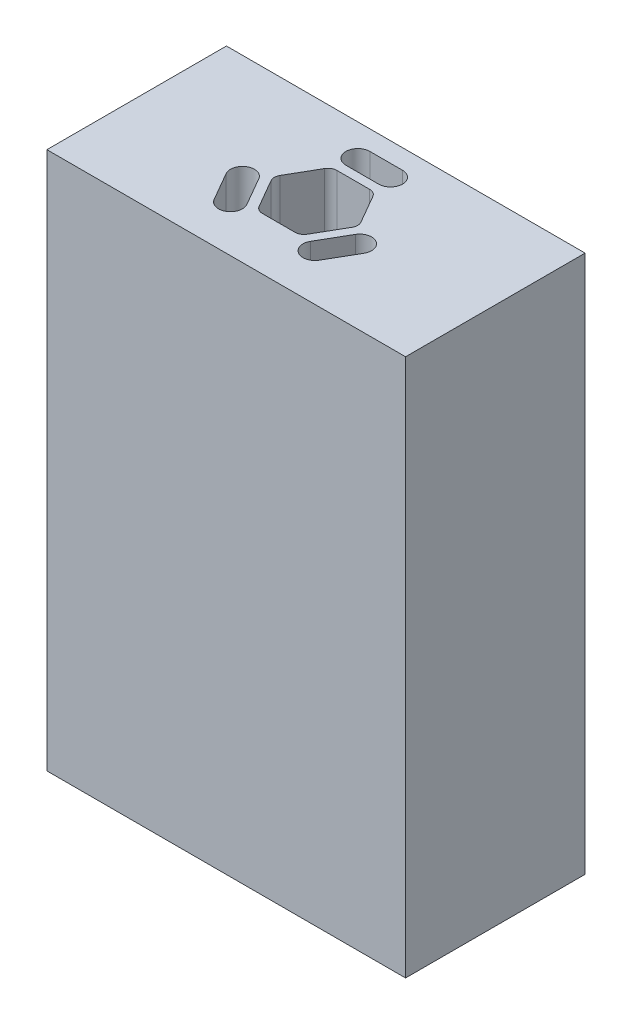
ISO-10303-21;
HEADER;
FILE_DESCRIPTION(('STEP AP214'),'2;1');
FILE_NAME('part.step','',(''),(''),'','','');
FILE_SCHEMA(('AUTOMOTIVE_DESIGN { 1 0 10303 214 1 1 1 1 }'));
ENDSEC;
DATA;
#1=APPLICATION_CONTEXT('core data for automotive mechanical design processes');
#2=APPLICATION_PROTOCOL_DEFINITION('international standard','automotive_design',2000,#1);
#3=PRODUCT_CONTEXT('',#1,'mechanical');
#4=PRODUCT('Part','Part','',(#3));
#5=PRODUCT_RELATED_PRODUCT_CATEGORY('part','',(#4));
#6=PRODUCT_DEFINITION_FORMATION('','',#4);
#7=PRODUCT_DEFINITION_CONTEXT('part definition',#1,'design');
#8=PRODUCT_DEFINITION('design','',#6,#7);
#9=PRODUCT_DEFINITION_SHAPE('','',#8);
#10=(LENGTH_UNIT() NAMED_UNIT(*) SI_UNIT(.MILLI.,.METRE.));
#11=(NAMED_UNIT(*) PLANE_ANGLE_UNIT() SI_UNIT($,.RADIAN.));
#12=(NAMED_UNIT(*) SI_UNIT($,.STERADIAN.) SOLID_ANGLE_UNIT());
#13=UNCERTAINTY_MEASURE_WITH_UNIT(LENGTH_MEASURE(1.E-05),#10,'distance_accuracy_value','');
#14=(GEOMETRIC_REPRESENTATION_CONTEXT(3) GLOBAL_UNCERTAINTY_ASSIGNED_CONTEXT((#13)) GLOBAL_UNIT_ASSIGNED_CONTEXT((#10,
#11,#12)) REPRESENTATION_CONTEXT('',''));
#15=CARTESIAN_POINT('',(0.,0.,0.));
#16=DIRECTION('',(0.,0.,1.));
#17=DIRECTION('',(1.,0.,0.));
#18=AXIS2_PLACEMENT_3D('',#15,#16,#17);
#19=CARTESIAN_POINT('',(-0.0911324865405191,-0.9,-0.157846096908266));
#20=DIRECTION('',(0.,-1.,0.));
#21=DIRECTION('',(0.,0.,-1.));
#22=AXIS2_PLACEMENT_3D('',#19,#20,#21);
#23=PLANE('',#22);
#24=DIRECTION('',(-1.,0.,0.));
#25=VECTOR('',#24,1.);
#26=CARTESIAN_POINT('',(0.0911324865405191,-0.9,-0.207846096908266));
#27=LINE('',#26,#25);
#28=CARTESIAN_POINT('',(0.0911324865405191,-0.9,-0.207846096908266));
#29=VERTEX_POINT('',#28);
#30=CARTESIAN_POINT('',(0.,-0.9,-0.207846096908266));
#31=VERTEX_POINT('',#30);
#32=EDGE_CURVE('E295',#29,#31,#27,.T.);
#33=ORIENTED_EDGE('',*,*,#32,.T.);
#34=CARTESIAN_POINT('',(0.,-0.9,0.));
#35=DIRECTION('',(0.,-1.,0.));
#36=DIRECTION('',(0.,0.,-1.));
#37=AXIS2_PLACEMENT_3D('',#34,#35,#36);
#38=CIRCLE('',#37,0.207846096908266);
#39=CARTESIAN_POINT('',(0.180000000000001,-0.9,-0.103923048454133));
#40=VERTEX_POINT('',#39);
#41=EDGE_CURVE('E11',#31,#40,#38,.T.);
#42=ORIENTED_EDGE('',*,*,#41,.T.);
#43=DIRECTION('',(-0.5,0.,-0.866025403784439));
#44=VECTOR('',#43,1.);
#45=CARTESIAN_POINT('',(0.22556624327026,-0.9,-0.0249999999999999));
#46=LINE('',#45,#44);
#47=CARTESIAN_POINT('',(0.134433756729741,-0.9,-0.182846096908266));
#48=VERTEX_POINT('',#47);
#49=EDGE_CURVE('E287',#40,#48,#46,.T.);
#50=ORIENTED_EDGE('',*,*,#49,.T.);
#51=CARTESIAN_POINT('',(0.0911324865405191,-0.9,-0.157846096908266));
#52=DIRECTION('',(0.,1.,0.));
#53=DIRECTION('',(0.,0.,1.));
#54=AXIS2_PLACEMENT_3D('',#51,#52,#53);
#55=CIRCLE('',#54,0.05);
#56=EDGE_CURVE('E291',#48,#29,#55,.T.);
#57=ORIENTED_EDGE('',*,*,#56,.T.);
#58=EDGE_LOOP('',(#33,#42,#50,#57));
#59=FACE_BOUND('',#58,.T.);
#60=ADVANCED_FACE('F33',(#59),#23,.F.);
#61=CARTESIAN_POINT('',(0.22556624327026,-0.9,-0.0249999999999999));
#62=VERTEX_POINT('',#61);
#63=EDGE_CURVE('E288',#62,#40,#46,.T.);
#64=ORIENTED_EDGE('',*,*,#63,.T.);
#65=CARTESIAN_POINT('',(0.180000000000001,-0.9,0.103923048454133));
#66=VERTEX_POINT('',#65);
#67=EDGE_CURVE('E42',#40,#66,#38,.T.);
#68=ORIENTED_EDGE('',*,*,#67,.T.);
#69=DIRECTION('',(0.5,0.,-0.866025403784438));
#70=VECTOR('',#69,1.);
#71=CARTESIAN_POINT('',(0.134433756729741,-0.9,0.182846096908266));
#72=LINE('',#71,#70);
#73=CARTESIAN_POINT('',(0.22556624327026,-0.9,0.0250000000000001));
#74=VERTEX_POINT('',#73);
#75=EDGE_CURVE('E280',#66,#74,#72,.T.);
#76=ORIENTED_EDGE('',*,*,#75,.T.);
#77=CARTESIAN_POINT('',(0.182264973081038,-0.9,0.));
#78=DIRECTION('',(0.,1.,0.));
#79=DIRECTION('',(0.,0.,1.));
#80=AXIS2_PLACEMENT_3D('',#77,#78,#79);
#81=CIRCLE('',#80,0.05);
#82=EDGE_CURVE('E284',#74,#62,#81,.T.);
#83=ORIENTED_EDGE('',*,*,#82,.T.);
#84=EDGE_LOOP('',(#64,#68,#76,#83));
#85=FACE_BOUND('',#84,.T.);
#86=ADVANCED_FACE('F416',(#85),#23,.F.);
#87=CARTESIAN_POINT('',(0.134433756729741,-0.9,0.182846096908266));
#88=VERTEX_POINT('',#87);
#89=EDGE_CURVE('E281',#88,#66,#72,.T.);
#90=ORIENTED_EDGE('',*,*,#89,.T.);
#91=CARTESIAN_POINT('',(0.,-0.9,0.207846096908266));
#92=VERTEX_POINT('',#91);
#93=EDGE_CURVE('E456',#66,#92,#38,.T.);
#94=ORIENTED_EDGE('',*,*,#93,.T.);
#95=DIRECTION('',(1.,0.,0.));
#96=VECTOR('',#95,1.);
#97=CARTESIAN_POINT('',(-0.091132486540519,-0.9,0.207846096908266));
#98=LINE('',#97,#96);
#99=CARTESIAN_POINT('',(0.0911324865405191,-0.9,0.207846096908266));
#100=VERTEX_POINT('',#99);
#101=EDGE_CURVE('E273',#92,#100,#98,.T.);
#102=ORIENTED_EDGE('',*,*,#101,.T.);
#103=CARTESIAN_POINT('',(0.0911324865405191,-0.9,0.157846096908266));
#104=DIRECTION('',(0.,1.,0.));
#105=DIRECTION('',(0.,0.,1.));
#106=AXIS2_PLACEMENT_3D('',#103,#104,#105);
#107=CIRCLE('',#106,0.05);
#108=EDGE_CURVE('E277',#100,#88,#107,.T.);
#109=ORIENTED_EDGE('',*,*,#108,.T.);
#110=EDGE_LOOP('',(#90,#94,#102,#109));
#111=FACE_BOUND('',#110,.T.);
#112=ADVANCED_FACE('F422',(#111),#23,.F.);
#113=CARTESIAN_POINT('',(-0.091132486540519,-0.9,0.207846096908266));
#114=VERTEX_POINT('',#113);
#115=EDGE_CURVE('E274',#114,#92,#98,.T.);
#116=ORIENTED_EDGE('',*,*,#115,.T.);
#117=CARTESIAN_POINT('',(-0.180000000000001,-0.9,0.103923048454133));
#118=VERTEX_POINT('',#117);
#119=EDGE_CURVE('E249',#92,#118,#38,.T.);
#120=ORIENTED_EDGE('',*,*,#119,.T.);
#121=DIRECTION('',(0.5,0.,0.866025403784439));
#122=VECTOR('',#121,1.);
#123=CARTESIAN_POINT('',(-0.22556624327026,-0.9,0.025));
#124=LINE('',#123,#122);
#125=CARTESIAN_POINT('',(-0.134433756729741,-0.9,0.182846096908266));
#126=VERTEX_POINT('',#125);
#127=EDGE_CURVE('E264',#118,#126,#124,.T.);
#128=ORIENTED_EDGE('',*,*,#127,.T.);
#129=CARTESIAN_POINT('',(-0.091132486540519,-0.9,0.157846096908266));
#130=DIRECTION('',(0.,1.,0.));
#131=DIRECTION('',(0.,0.,1.));
#132=AXIS2_PLACEMENT_3D('',#129,#130,#131);
#133=CIRCLE('',#132,0.05);
#134=EDGE_CURVE('E270',#126,#114,#133,.T.);
#135=ORIENTED_EDGE('',*,*,#134,.T.);
#136=EDGE_LOOP('',(#116,#120,#128,#135));
#137=FACE_BOUND('',#136,.T.);
#138=ADVANCED_FACE('F437',(#137),#23,.F.);
#139=CARTESIAN_POINT('',(-0.22556624327026,-0.9,0.025));
#140=VERTEX_POINT('',#139);
#141=EDGE_CURVE('E248',#140,#118,#124,.T.);
#142=ORIENTED_EDGE('',*,*,#141,.T.);
#143=CARTESIAN_POINT('',(-0.18,-0.9,-0.103923048454133));
#144=VERTEX_POINT('',#143);
#145=EDGE_CURVE('E234',#118,#144,#38,.T.);
#146=ORIENTED_EDGE('',*,*,#145,.T.);
#147=DIRECTION('',(-0.5,0.,0.866025403784439));
#148=VECTOR('',#147,1.);
#149=CARTESIAN_POINT('',(-0.134433756729741,-0.9,-0.182846096908266));
#150=LINE('',#149,#148);
#151=CARTESIAN_POINT('',(-0.22556624327026,-0.9,-0.025));
#152=VERTEX_POINT('',#151);
#153=EDGE_CURVE('E245',#144,#152,#150,.T.);
#154=ORIENTED_EDGE('',*,*,#153,.T.);
#155=CARTESIAN_POINT('',(-0.182264973081038,-0.9,0.));
#156=DIRECTION('',(0.,1.,0.));
#157=DIRECTION('',(0.,0.,-1.));
#158=AXIS2_PLACEMENT_3D('',#155,#156,#157);
#159=CIRCLE('',#158,0.05);
#160=EDGE_CURVE('E263',#152,#140,#159,.T.);
#161=ORIENTED_EDGE('',*,*,#160,.T.);
#162=EDGE_LOOP('',(#142,#146,#154,#161));
#163=FACE_BOUND('',#162,.T.);
#164=ADVANCED_FACE('F243',(#163),#23,.F.);
#165=CARTESIAN_POINT('',(-1.,-3.,0.500574297253042));
#166=DIRECTION('',(1.,0.,0.));
#167=DIRECTION('',(0.,0.,-1.));
#168=AXIS2_PLACEMENT_3D('',#165,#166,#167);
#169=PLANE('',#168);
#170=DIRECTION('',(0.,0.,-1.));
#171=VECTOR('',#170,1.);
#172=CARTESIAN_POINT('',(-1.,0.,0.500574297253042));
#173=LINE('',#172,#171);
#174=CARTESIAN_POINT('',(-1.,0.,0.500574297253042));
#175=VERTEX_POINT('',#174);
#176=CARTESIAN_POINT('',(-1.,0.,-0.500574297253042));
#177=VERTEX_POINT('',#176);
#178=EDGE_CURVE('E332',#175,#177,#173,.T.);
#179=ORIENTED_EDGE('',*,*,#178,.T.);
#180=DIRECTION('',(0.,1.,0.));
#181=VECTOR('',#180,1.);
#182=CARTESIAN_POINT('',(-1.,-3.,-0.500574297253042));
#183=LINE('',#182,#181);
#184=CARTESIAN_POINT('',(-1.,-3.,-0.500574297253042));
#185=VERTEX_POINT('',#184);
#186=EDGE_CURVE('E239',#185,#177,#183,.T.);
#187=ORIENTED_EDGE('',*,*,#186,.F.);
#188=DIRECTION('',(0.,0.,-1.));
#189=VECTOR('',#188,1.);
#190=CARTESIAN_POINT('',(-1.,-3.,0.500574297253042));
#191=LINE('',#190,#189);
#192=CARTESIAN_POINT('',(-1.,-3.,0.500574297253042));
#193=VERTEX_POINT('',#192);
#194=EDGE_CURVE('E357',#193,#185,#191,.T.);
#195=ORIENTED_EDGE('',*,*,#194,.F.);
#196=DIRECTION('',(0.,1.,0.));
#197=VECTOR('',#196,1.);
#198=CARTESIAN_POINT('',(-1.,-3.,0.500574297253042));
#199=LINE('',#198,#197);
#200=EDGE_CURVE('E367',#193,#175,#199,.T.);
#201=ORIENTED_EDGE('',*,*,#200,.T.);
#202=EDGE_LOOP('',(#179,#187,#195,#201));
#203=FACE_BOUND('',#202,.T.);
#204=ADVANCED_FACE('F35',(#203),#169,.F.);
#205=CARTESIAN_POINT('',(1.,-3.,-0.500574297253042));
#206=DIRECTION('',(0.,0.,1.));
#207=DIRECTION('',(1.,0.,0.));
#208=AXIS2_PLACEMENT_3D('',#205,#206,#207);
#209=PLANE('',#208);
#210=DIRECTION('',(1.,0.,0.));
#211=VECTOR('',#210,1.);
#212=CARTESIAN_POINT('',(1.,0.,-0.500574297253042));
#213=LINE('',#212,#211);
#214=CARTESIAN_POINT('',(1.,0.,-0.500574297253042));
#215=VERTEX_POINT('',#214);
#216=EDGE_CURVE('E370',#177,#215,#213,.T.);
#217=ORIENTED_EDGE('',*,*,#216,.T.);
#218=DIRECTION('',(0.,1.,0.));
#219=VECTOR('',#218,1.);
#220=CARTESIAN_POINT('',(1.,-3.,-0.500574297253042));
#221=LINE('',#220,#219);
#222=CARTESIAN_POINT('',(1.,-3.,-0.500574297253042));
#223=VERTEX_POINT('',#222);
#224=EDGE_CURVE('E380',#223,#215,#221,.T.);
#225=ORIENTED_EDGE('',*,*,#224,.F.);
#226=DIRECTION('',(1.,0.,0.));
#227=VECTOR('',#226,1.);
#228=CARTESIAN_POINT('',(1.,-3.,-0.500574297253042));
#229=LINE('',#228,#227);
#230=EDGE_CURVE('E360',#185,#223,#229,.T.);
#231=ORIENTED_EDGE('',*,*,#230,.F.);
#232=ORIENTED_EDGE('',*,*,#186,.T.);
#233=EDGE_LOOP('',(#217,#225,#231,#232));
#234=FACE_BOUND('',#233,.T.);
#235=ADVANCED_FACE('F385',(#234),#209,.F.);
#236=CARTESIAN_POINT('',(1.,-3.,0.500574297253042));
#237=DIRECTION('',(-1.,0.,0.));
#238=DIRECTION('',(0.,0.,1.));
#239=AXIS2_PLACEMENT_3D('',#236,#237,#238);
#240=PLANE('',#239);
#241=DIRECTION('',(0.,0.,1.));
#242=VECTOR('',#241,1.);
#243=CARTESIAN_POINT('',(1.,0.,0.500574297253042));
#244=LINE('',#243,#242);
#245=CARTESIAN_POINT('',(1.,0.,0.500574297253042));
#246=VERTEX_POINT('',#245);
#247=EDGE_CURVE('E372',#215,#246,#244,.T.);
#248=ORIENTED_EDGE('',*,*,#247,.T.);
#249=DIRECTION('',(0.,1.,0.));
#250=VECTOR('',#249,1.);
#251=CARTESIAN_POINT('',(1.,-3.,0.500574297253042));
#252=LINE('',#251,#250);
#253=CARTESIAN_POINT('',(1.,-3.,0.500574297253042));
#254=VERTEX_POINT('',#253);
#255=EDGE_CURVE('E377',#254,#246,#252,.T.);
#256=ORIENTED_EDGE('',*,*,#255,.F.);
#257=DIRECTION('',(0.,0.,1.));
#258=VECTOR('',#257,1.);
#259=CARTESIAN_POINT('',(1.,-3.,0.500574297253042));
#260=LINE('',#259,#258);
#261=EDGE_CURVE('E363',#223,#254,#260,.T.);
#262=ORIENTED_EDGE('',*,*,#261,.F.);
#263=ORIENTED_EDGE('',*,*,#224,.T.);
#264=EDGE_LOOP('',(#248,#256,#262,#263));
#265=FACE_BOUND('',#264,.T.);
#266=ADVANCED_FACE('F397',(#265),#240,.F.);
#267=CARTESIAN_POINT('',(1.,-3.,0.500574297253042));
#268=DIRECTION('',(0.,0.,-1.));
#269=DIRECTION('',(-1.,0.,0.));
#270=AXIS2_PLACEMENT_3D('',#267,#268,#269);
#271=PLANE('',#270);
#272=DIRECTION('',(-1.,0.,0.));
#273=VECTOR('',#272,1.);
#274=CARTESIAN_POINT('',(1.,0.,0.500574297253042));
#275=LINE('',#274,#273);
#276=EDGE_CURVE('E361',#246,#175,#275,.T.);
#277=ORIENTED_EDGE('',*,*,#276,.T.);
#278=ORIENTED_EDGE('',*,*,#200,.F.);
#279=DIRECTION('',(-1.,0.,0.));
#280=VECTOR('',#279,1.);
#281=CARTESIAN_POINT('',(1.,-3.,0.500574297253042));
#282=LINE('',#281,#280);
#283=EDGE_CURVE('E365',#254,#193,#282,.T.);
#284=ORIENTED_EDGE('',*,*,#283,.F.);
#285=ORIENTED_EDGE('',*,*,#255,.T.);
#286=EDGE_LOOP('',(#277,#278,#284,#285));
#287=FACE_BOUND('',#286,.T.);
#288=ADVANCED_FACE('F401',(#287),#271,.F.);
#289=CARTESIAN_POINT('',(0.,-3.,0.));
#290=DIRECTION('',(0.,1.,0.));
#291=DIRECTION('',(0.,0.,1.));
#292=AXIS2_PLACEMENT_3D('',#289,#290,#291);
#293=PLANE('',#292);
#294=ORIENTED_EDGE('',*,*,#194,.T.);
#295=ORIENTED_EDGE('',*,*,#230,.T.);
#296=ORIENTED_EDGE('',*,*,#261,.T.);
#297=ORIENTED_EDGE('',*,*,#283,.T.);
#298=EDGE_LOOP('',(#294,#295,#296,#297));
#299=FACE_BOUND('',#298,.T.);
#300=ADVANCED_FACE('F403',(#299),#293,.F.);
#301=CARTESIAN_POINT('',(0.,0.,0.));
#302=DIRECTION('',(0.,1.,0.));
#303=DIRECTION('',(0.,0.,1.));
#304=AXIS2_PLACEMENT_3D('',#301,#302,#303);
#305=PLANE('',#304);
#306=CARTESIAN_POINT('',(-0.0911324865405191,0.,-0.324640742222522));
#307=DIRECTION('',(0.,1.,0.));
#308=DIRECTION('',(0.,0.,-1.));
#309=AXIS2_PLACEMENT_3D('',#306,#307,#308);
#310=CIRCLE('',#309,0.066794645314256);
#311=CARTESIAN_POINT('',(-0.0911324865405191,0.,-0.391435387536778));
#312=VERTEX_POINT('',#311);
#313=CARTESIAN_POINT('',(-0.0911324865405191,0.,-0.257846096908266));
#314=VERTEX_POINT('',#313);
#315=EDGE_CURVE('E55',#312,#314,#310,.T.);
#316=ORIENTED_EDGE('',*,*,#315,.F.);
#317=DIRECTION('',(-1.,0.,0.));
#318=VECTOR('',#317,1.);
#319=CARTESIAN_POINT('',(-0.0911324865405191,0.,-0.391435387536778));
#320=LINE('',#319,#318);
#321=CARTESIAN_POINT('',(0.0911324865405191,0.,-0.391435387536778));
#322=VERTEX_POINT('',#321);
#323=EDGE_CURVE('E699',#322,#312,#320,.T.);
#324=ORIENTED_EDGE('',*,*,#323,.F.);
#325=CARTESIAN_POINT('',(0.0911324865405191,0.,-0.324640742222522));
#326=DIRECTION('',(0.,1.,0.));
#327=DIRECTION('',(0.,0.,1.));
#328=AXIS2_PLACEMENT_3D('',#325,#326,#327);
#329=CIRCLE('',#328,0.066794645314256);
#330=CARTESIAN_POINT('',(0.0911324865405191,0.,-0.257846096908266));
#331=VERTEX_POINT('',#330);
#332=EDGE_CURVE('E714',#331,#322,#329,.T.);
#333=ORIENTED_EDGE('',*,*,#332,.F.);
#334=DIRECTION('',(1.,0.,0.));
#335=VECTOR('',#334,1.);
#336=CARTESIAN_POINT('',(-0.0911324865405191,0.,-0.257846096908266));
#337=LINE('',#336,#335);
#338=EDGE_CURVE('E710',#314,#331,#337,.T.);
#339=ORIENTED_EDGE('',*,*,#338,.F.);
#340=EDGE_LOOP('',(#316,#324,#333,#339));
#341=FACE_BOUND('',#340,.T.);
#342=CARTESIAN_POINT('',(0.326713373138399,0.,0.083397322657128));
#343=DIRECTION('',(0.,1.,0.));
#344=DIRECTION('',(0.,0.,-1.));
#345=AXIS2_PLACEMENT_3D('',#342,#343,#344);
#346=CIRCLE('',#345,0.066794645314256);
#347=CARTESIAN_POINT('',(0.384559232817316,0.,0.116794645314256));
#348=VERTEX_POINT('',#347);
#349=CARTESIAN_POINT('',(0.268867513459482,0.,0.05));
#350=VERTEX_POINT('',#349);
#351=EDGE_CURVE('E678',#348,#350,#346,.T.);
#352=ORIENTED_EDGE('',*,*,#351,.F.);
#353=DIRECTION('',(0.5,0.,-0.866025403784439));
#354=VECTOR('',#353,1.);
#355=CARTESIAN_POINT('',(0.293426746276797,0.,0.274640742222522));
#356=LINE('',#355,#354);
#357=CARTESIAN_POINT('',(0.293426746276797,0.,0.274640742222522));
#358=VERTEX_POINT('',#357);
#359=EDGE_CURVE('E729',#358,#348,#356,.T.);
#360=ORIENTED_EDGE('',*,*,#359,.F.);
#361=CARTESIAN_POINT('',(0.23558088659788,0.,0.241243419565394));
#362=DIRECTION('',(0.,1.,0.));
#363=DIRECTION('',(0.,0.,1.));
#364=AXIS2_PLACEMENT_3D('',#361,#362,#363);
#365=CIRCLE('',#364,0.066794645314256);
#366=CARTESIAN_POINT('',(0.177735026918963,0.,0.207846096908266));
#367=VERTEX_POINT('',#366);
#368=EDGE_CURVE('E743',#367,#358,#365,.T.);
#369=ORIENTED_EDGE('',*,*,#368,.F.);
#370=DIRECTION('',(-0.5,0.,0.866025403784439));
#371=VECTOR('',#370,1.);
#372=CARTESIAN_POINT('',(0.177735026918963,0.,0.207846096908266));
#373=LINE('',#372,#371);
#374=EDGE_CURVE('E740',#350,#367,#373,.T.);
#375=ORIENTED_EDGE('',*,*,#374,.F.);
#376=EDGE_LOOP('',(#352,#360,#369,#375));
#377=FACE_BOUND('',#376,.T.);
#378=CARTESIAN_POINT('',(-0.23558088659788,0.,0.241243419565394));
#379=DIRECTION('',(0.,1.,0.));
#380=DIRECTION('',(0.,0.,-1.));
#381=AXIS2_PLACEMENT_3D('',#378,#379,#380);
#382=CIRCLE('',#381,0.066794645314256);
#383=CARTESIAN_POINT('',(-0.293426746276797,0.,0.274640742222522));
#384=VERTEX_POINT('',#383);
#385=CARTESIAN_POINT('',(-0.177735026918963,0.,0.207846096908266));
#386=VERTEX_POINT('',#385);
#387=EDGE_CURVE('E665',#384,#386,#382,.T.);
#388=ORIENTED_EDGE('',*,*,#387,.F.);
#389=DIRECTION('',(0.500000000000001,0.,0.866025403784438));
#390=VECTOR('',#389,1.);
#391=CARTESIAN_POINT('',(-0.384559232817316,0.,0.116794645314256));
#392=LINE('',#391,#390);
#393=CARTESIAN_POINT('',(-0.384559232817316,0.,0.116794645314256));
#394=VERTEX_POINT('',#393);
#395=EDGE_CURVE('E670',#394,#384,#392,.T.);
#396=ORIENTED_EDGE('',*,*,#395,.F.);
#397=CARTESIAN_POINT('',(-0.326713373138399,0.,0.0833973226571282));
#398=DIRECTION('',(0.,1.,0.));
#399=DIRECTION('',(0.,0.,1.));
#400=AXIS2_PLACEMENT_3D('',#397,#398,#399);
#401=CIRCLE('',#400,0.066794645314256);
#402=CARTESIAN_POINT('',(-0.268867513459482,0.,0.0500000000000002));
#403=VERTEX_POINT('',#402);
#404=EDGE_CURVE('E664',#403,#394,#401,.T.);
#405=ORIENTED_EDGE('',*,*,#404,.F.);
#406=DIRECTION('',(-0.500000000000001,0.,-0.866025403784438));
#407=VECTOR('',#406,1.);
#408=CARTESIAN_POINT('',(-0.268867513459482,0.,0.0500000000000002));
#409=LINE('',#408,#407);
#410=EDGE_CURVE('E656',#386,#403,#409,.T.);
#411=ORIENTED_EDGE('',*,*,#410,.F.);
#412=EDGE_LOOP('',(#388,#396,#405,#411));
#413=FACE_BOUND('',#412,.T.);
#414=CARTESIAN_POINT('',(-0.0911324865405191,0.,-0.157846096908266));
#415=DIRECTION('',(0.,1.,0.));
#416=DIRECTION('',(0.,0.,-1.));
#417=AXIS2_PLACEMENT_3D('',#414,#415,#416);
#418=CIRCLE('',#417,0.05);
#419=CARTESIAN_POINT('',(-0.0911324865405191,0.,-0.207846096908266));
#420=VERTEX_POINT('',#419);
#421=CARTESIAN_POINT('',(-0.134433756729741,0.,-0.182846096908266));
#422=VERTEX_POINT('',#421);
#423=EDGE_CURVE('E299',#420,#422,#418,.T.);
#424=ORIENTED_EDGE('',*,*,#423,.F.);
#425=DIRECTION('',(-1.,0.,0.));
#426=VECTOR('',#425,1.);
#427=CARTESIAN_POINT('',(0.0911324865405191,0.,-0.207846096908266));
#428=LINE('',#427,#426);
#429=CARTESIAN_POINT('',(0.0911324865405191,0.,-0.207846096908266));
#430=VERTEX_POINT('',#429);
#431=EDGE_CURVE('E327',#430,#420,#428,.T.);
#432=ORIENTED_EDGE('',*,*,#431,.F.);
#433=CARTESIAN_POINT('',(0.0911324865405191,0.,-0.157846096908266));
#434=DIRECTION('',(0.,1.,0.));
#435=DIRECTION('',(0.,0.,1.));
#436=AXIS2_PLACEMENT_3D('',#433,#434,#435);
#437=CIRCLE('',#436,0.05);
#438=CARTESIAN_POINT('',(0.134433756729741,0.,-0.182846096908266));
#439=VERTEX_POINT('',#438);
#440=EDGE_CURVE('E324',#439,#430,#437,.T.);
#441=ORIENTED_EDGE('',*,*,#440,.F.);
#442=DIRECTION('',(-0.5,0.,-0.866025403784439));
#443=VECTOR('',#442,1.);
#444=CARTESIAN_POINT('',(0.22556624327026,0.,-0.0249999999999999));
#445=LINE('',#444,#443);
#446=CARTESIAN_POINT('',(0.22556624327026,0.,-0.0249999999999999));
#447=VERTEX_POINT('',#446);
#448=EDGE_CURVE('E322',#447,#439,#445,.T.);
#449=ORIENTED_EDGE('',*,*,#448,.F.);
#450=CARTESIAN_POINT('',(0.182264973081038,0.,0.));
#451=DIRECTION('',(0.,1.,0.));
#452=DIRECTION('',(0.,0.,1.));
#453=AXIS2_PLACEMENT_3D('',#450,#451,#452);
#454=CIRCLE('',#453,0.05);
#455=CARTESIAN_POINT('',(0.22556624327026,0.,0.0250000000000001));
#456=VERTEX_POINT('',#455);
#457=EDGE_CURVE('E319',#456,#447,#454,.T.);
#458=ORIENTED_EDGE('',*,*,#457,.F.);
#459=DIRECTION('',(0.5,0.,-0.866025403784438));
#460=VECTOR('',#459,1.);
#461=CARTESIAN_POINT('',(0.134433756729741,0.,0.182846096908266));
#462=LINE('',#461,#460);
#463=CARTESIAN_POINT('',(0.134433756729741,0.,0.182846096908266));
#464=VERTEX_POINT('',#463);
#465=EDGE_CURVE('E317',#464,#456,#462,.T.);
#466=ORIENTED_EDGE('',*,*,#465,.F.);
#467=CARTESIAN_POINT('',(0.0911324865405191,0.,0.157846096908266));
#468=DIRECTION('',(0.,1.,0.));
#469=DIRECTION('',(0.,0.,1.));
#470=AXIS2_PLACEMENT_3D('',#467,#468,#469);
#471=CIRCLE('',#470,0.05);
#472=CARTESIAN_POINT('',(0.0911324865405191,0.,0.207846096908266));
#473=VERTEX_POINT('',#472);
#474=EDGE_CURVE('E314',#473,#464,#471,.T.);
#475=ORIENTED_EDGE('',*,*,#474,.F.);
#476=DIRECTION('',(1.,0.,0.));
#477=VECTOR('',#476,1.);
#478=CARTESIAN_POINT('',(-0.091132486540519,0.,0.207846096908266));
#479=LINE('',#478,#477);
#480=CARTESIAN_POINT('',(-0.091132486540519,0.,0.207846096908266));
#481=VERTEX_POINT('',#480);
#482=EDGE_CURVE('E312',#481,#473,#479,.T.);
#483=ORIENTED_EDGE('',*,*,#482,.F.);
#484=CARTESIAN_POINT('',(-0.091132486540519,0.,0.157846096908266));
#485=DIRECTION('',(0.,1.,0.));
#486=DIRECTION('',(0.,0.,1.));
#487=AXIS2_PLACEMENT_3D('',#484,#485,#486);
#488=CIRCLE('',#487,0.05);
#489=CARTESIAN_POINT('',(-0.134433756729741,0.,0.182846096908266));
#490=VERTEX_POINT('',#489);
#491=EDGE_CURVE('E309',#490,#481,#488,.T.);
#492=ORIENTED_EDGE('',*,*,#491,.F.);
#493=DIRECTION('',(0.5,0.,0.866025403784439));
#494=VECTOR('',#493,1.);
#495=CARTESIAN_POINT('',(-0.22556624327026,0.,0.025));
#496=LINE('',#495,#494);
#497=CARTESIAN_POINT('',(-0.22556624327026,0.,0.025));
#498=VERTEX_POINT('',#497);
#499=EDGE_CURVE('E307',#498,#490,#496,.T.);
#500=ORIENTED_EDGE('',*,*,#499,.F.);
#501=CARTESIAN_POINT('',(-0.182264973081038,0.,0.));
#502=DIRECTION('',(0.,1.,0.));
#503=DIRECTION('',(0.,0.,-1.));
#504=AXIS2_PLACEMENT_3D('',#501,#502,#503);
#505=CIRCLE('',#504,0.05);
#506=CARTESIAN_POINT('',(-0.22556624327026,0.,-0.025));
#507=VERTEX_POINT('',#506);
#508=EDGE_CURVE('E304',#507,#498,#505,.T.);
#509=ORIENTED_EDGE('',*,*,#508,.F.);
#510=DIRECTION('',(-0.5,0.,0.866025403784439));
#511=VECTOR('',#510,1.);
#512=CARTESIAN_POINT('',(-0.134433756729741,0.,-0.182846096908266));
#513=LINE('',#512,#511);
#514=EDGE_CURVE('E301',#422,#507,#513,.T.);
#515=ORIENTED_EDGE('',*,*,#514,.F.);
#516=EDGE_LOOP('',(#424,#432,#441,#449,#458,#466,#475,#483,#492,#500,#509,#515));
#517=FACE_BOUND('',#516,.T.);
#518=ORIENTED_EDGE('',*,*,#178,.F.);
#519=ORIENTED_EDGE('',*,*,#276,.F.);
#520=ORIENTED_EDGE('',*,*,#247,.F.);
#521=ORIENTED_EDGE('',*,*,#216,.F.);
#522=EDGE_LOOP('',(#518,#519,#520,#521));
#523=FACE_BOUND('',#522,.T.);
#524=ADVANCED_FACE('F393',(#341,#377,#413,#517,#523),#305,.T.);
#525=CARTESIAN_POINT('',(-0.0911324865405191,-0.9,-0.157846096908266));
#526=DIRECTION('',(0.,1.,0.));
#527=DIRECTION('',(0.,0.,1.));
#528=AXIS2_PLACEMENT_3D('',#525,#526,#527);
#529=CYLINDRICAL_SURFACE('',#528,0.05);
#530=ORIENTED_EDGE('',*,*,#423,.T.);
#531=DIRECTION('',(0.,1.,0.));
#532=VECTOR('',#531,1.);
#533=CARTESIAN_POINT('',(-0.134433756729741,-0.9,-0.182846096908266));
#534=LINE('',#533,#532);
#535=CARTESIAN_POINT('',(-0.134433756729741,-0.9,-0.182846096908266));
#536=VERTEX_POINT('',#535);
#537=EDGE_CURVE('E298',#536,#422,#534,.T.);
#538=ORIENTED_EDGE('',*,*,#537,.F.);
#539=CARTESIAN_POINT('',(-0.0911324865405191,-0.9,-0.157846096908266));
#540=DIRECTION('',(0.,1.,0.));
#541=DIRECTION('',(0.,0.,-1.));
#542=AXIS2_PLACEMENT_3D('',#539,#540,#541);
#543=CIRCLE('',#542,0.05);
#544=CARTESIAN_POINT('',(-0.0911324865405191,-0.9,-0.207846096908266));
#545=VERTEX_POINT('',#544);
#546=EDGE_CURVE('E259',#545,#536,#543,.T.);
#547=ORIENTED_EDGE('',*,*,#546,.F.);
#548=DIRECTION('',(0.,1.,0.));
#549=VECTOR('',#548,1.);
#550=CARTESIAN_POINT('',(-0.0911324865405191,-0.9,-0.207846096908266));
#551=LINE('',#550,#549);
#552=EDGE_CURVE('E329',#545,#420,#551,.T.);
#553=ORIENTED_EDGE('',*,*,#552,.T.);
#554=EDGE_LOOP('',(#530,#538,#547,#553));
#555=FACE_BOUND('',#554,.T.);
#556=ADVANCED_FACE('F410',(#555),#529,.F.);
#557=CARTESIAN_POINT('',(0.0911324865405191,-0.9,-0.207846096908266));
#558=DIRECTION('',(0.,0.,-1.));
#559=DIRECTION('',(-1.,0.,0.));
#560=AXIS2_PLACEMENT_3D('',#557,#558,#559);
#561=PLANE('',#560);
#562=EDGE_CURVE('E294',#31,#545,#27,.T.);
#563=ORIENTED_EDGE('',*,*,#562,.F.);
#564=ORIENTED_EDGE('',*,*,#32,.F.);
#565=DIRECTION('',(0.,1.,0.));
#566=VECTOR('',#565,1.);
#567=CARTESIAN_POINT('',(0.0911324865405191,-0.9,-0.207846096908266));
#568=LINE('',#567,#566);
#569=EDGE_CURVE('E333',#29,#430,#568,.T.);
#570=ORIENTED_EDGE('',*,*,#569,.T.);
#571=ORIENTED_EDGE('',*,*,#431,.T.);
#572=ORIENTED_EDGE('',*,*,#552,.F.);
#573=EDGE_LOOP('',(#563,#564,#570,#571,#572));
#574=FACE_BOUND('',#573,.T.);
#575=ADVANCED_FACE('F477',(#574),#561,.F.);
#576=CARTESIAN_POINT('',(0.0911324865405191,-0.9,-0.157846096908266));
#577=DIRECTION('',(0.,1.,0.));
#578=DIRECTION('',(0.,0.,1.));
#579=AXIS2_PLACEMENT_3D('',#576,#577,#578);
#580=CYLINDRICAL_SURFACE('',#579,0.05);
#581=ORIENTED_EDGE('',*,*,#440,.T.);
#582=ORIENTED_EDGE('',*,*,#569,.F.);
#583=ORIENTED_EDGE('',*,*,#56,.F.);
#584=DIRECTION('',(0.,1.,0.));
#585=VECTOR('',#584,1.);
#586=CARTESIAN_POINT('',(0.134433756729741,-0.9,-0.182846096908266));
#587=LINE('',#586,#585);
#588=EDGE_CURVE('E335',#48,#439,#587,.T.);
#589=ORIENTED_EDGE('',*,*,#588,.T.);
#590=EDGE_LOOP('',(#581,#582,#583,#589));
#591=FACE_BOUND('',#590,.T.);
#592=ADVANCED_FACE('F499',(#591),#580,.F.);
#593=CARTESIAN_POINT('',(0.22556624327026,-0.9,-0.0249999999999999));
#594=DIRECTION('',(0.866025403784439,0.,-0.5));
#595=DIRECTION('',(-0.5,0.,-0.866025403784439));
#596=AXIS2_PLACEMENT_3D('',#593,#594,#595);
#597=PLANE('',#596);
#598=ORIENTED_EDGE('',*,*,#49,.F.);
#599=ORIENTED_EDGE('',*,*,#63,.F.);
#600=DIRECTION('',(0.,1.,0.));
#601=VECTOR('',#600,1.);
#602=CARTESIAN_POINT('',(0.22556624327026,-0.9,-0.0249999999999999));
#603=LINE('',#602,#601);
#604=EDGE_CURVE('E338',#62,#447,#603,.T.);
#605=ORIENTED_EDGE('',*,*,#604,.T.);
#606=ORIENTED_EDGE('',*,*,#448,.T.);
#607=ORIENTED_EDGE('',*,*,#588,.F.);
#608=EDGE_LOOP('',(#598,#599,#605,#606,#607));
#609=FACE_BOUND('',#608,.T.);
#610=ADVANCED_FACE('F472',(#609),#597,.F.);
#611=CARTESIAN_POINT('',(0.182264973081038,-0.9,0.));
#612=DIRECTION('',(0.,1.,0.));
#613=DIRECTION('',(0.,0.,1.));
#614=AXIS2_PLACEMENT_3D('',#611,#612,#613);
#615=CYLINDRICAL_SURFACE('',#614,0.05);
#616=ORIENTED_EDGE('',*,*,#457,.T.);
#617=ORIENTED_EDGE('',*,*,#604,.F.);
#618=ORIENTED_EDGE('',*,*,#82,.F.);
#619=DIRECTION('',(0.,1.,0.));
#620=VECTOR('',#619,1.);
#621=CARTESIAN_POINT('',(0.22556624327026,-0.9,0.0250000000000001));
#622=LINE('',#621,#620);
#623=EDGE_CURVE('E340',#74,#456,#622,.T.);
#624=ORIENTED_EDGE('',*,*,#623,.T.);
#625=EDGE_LOOP('',(#616,#617,#618,#624));
#626=FACE_BOUND('',#625,.T.);
#627=ADVANCED_FACE('F468',(#626),#615,.F.);
#628=CARTESIAN_POINT('',(0.134433756729741,-0.9,0.182846096908266));
#629=DIRECTION('',(0.866025403784438,0.,0.5));
#630=DIRECTION('',(0.5,0.,-0.866025403784439));
#631=AXIS2_PLACEMENT_3D('',#628,#629,#630);
#632=PLANE('',#631);
#633=ORIENTED_EDGE('',*,*,#75,.F.);
#634=ORIENTED_EDGE('',*,*,#89,.F.);
#635=DIRECTION('',(0.,1.,0.));
#636=VECTOR('',#635,1.);
#637=CARTESIAN_POINT('',(0.134433756729741,-0.9,0.182846096908266));
#638=LINE('',#637,#636);
#639=EDGE_CURVE('E343',#88,#464,#638,.T.);
#640=ORIENTED_EDGE('',*,*,#639,.T.);
#641=ORIENTED_EDGE('',*,*,#465,.T.);
#642=ORIENTED_EDGE('',*,*,#623,.F.);
#643=EDGE_LOOP('',(#633,#634,#640,#641,#642));
#644=FACE_BOUND('',#643,.T.);
#645=ADVANCED_FACE('F463',(#644),#632,.F.);
#646=CARTESIAN_POINT('',(0.0911324865405191,-0.9,0.157846096908266));
#647=DIRECTION('',(0.,1.,0.));
#648=DIRECTION('',(0.,0.,1.));
#649=AXIS2_PLACEMENT_3D('',#646,#647,#648);
#650=CYLINDRICAL_SURFACE('',#649,0.05);
#651=ORIENTED_EDGE('',*,*,#474,.T.);
#652=ORIENTED_EDGE('',*,*,#639,.F.);
#653=ORIENTED_EDGE('',*,*,#108,.F.);
#654=DIRECTION('',(0.,1.,0.));
#655=VECTOR('',#654,1.);
#656=CARTESIAN_POINT('',(0.0911324865405191,-0.9,0.207846096908266));
#657=LINE('',#656,#655);
#658=EDGE_CURVE('E345',#100,#473,#657,.T.);
#659=ORIENTED_EDGE('',*,*,#658,.T.);
#660=EDGE_LOOP('',(#651,#652,#653,#659));
#661=FACE_BOUND('',#660,.T.);
#662=ADVANCED_FACE('F496',(#661),#650,.F.);
#663=CARTESIAN_POINT('',(-0.091132486540519,-0.9,0.207846096908266));
#664=DIRECTION('',(0.,0.,1.));
#665=DIRECTION('',(1.,0.,0.));
#666=AXIS2_PLACEMENT_3D('',#663,#664,#665);
#667=PLANE('',#666);
#668=ORIENTED_EDGE('',*,*,#101,.F.);
#669=ORIENTED_EDGE('',*,*,#115,.F.);
#670=DIRECTION('',(0.,1.,0.));
#671=VECTOR('',#670,1.);
#672=CARTESIAN_POINT('',(-0.091132486540519,-0.9,0.207846096908266));
#673=LINE('',#672,#671);
#674=EDGE_CURVE('E348',#114,#481,#673,.T.);
#675=ORIENTED_EDGE('',*,*,#674,.T.);
#676=ORIENTED_EDGE('',*,*,#482,.T.);
#677=ORIENTED_EDGE('',*,*,#658,.F.);
#678=EDGE_LOOP('',(#668,#669,#675,#676,#677));
#679=FACE_BOUND('',#678,.T.);
#680=ADVANCED_FACE('F452',(#679),#667,.F.);
#681=CARTESIAN_POINT('',(-0.091132486540519,-0.9,0.157846096908266));
#682=DIRECTION('',(0.,1.,0.));
#683=DIRECTION('',(0.,0.,1.));
#684=AXIS2_PLACEMENT_3D('',#681,#682,#683);
#685=CYLINDRICAL_SURFACE('',#684,0.05);
#686=ORIENTED_EDGE('',*,*,#491,.T.);
#687=ORIENTED_EDGE('',*,*,#674,.F.);
#688=ORIENTED_EDGE('',*,*,#134,.F.);
#689=DIRECTION('',(0.,1.,0.));
#690=VECTOR('',#689,1.);
#691=CARTESIAN_POINT('',(-0.134433756729741,-0.9,0.182846096908266));
#692=LINE('',#691,#690);
#693=EDGE_CURVE('E350',#126,#490,#692,.T.);
#694=ORIENTED_EDGE('',*,*,#693,.T.);
#695=EDGE_LOOP('',(#686,#687,#688,#694));
#696=FACE_BOUND('',#695,.T.);
#697=ADVANCED_FACE('F492',(#696),#685,.F.);
#698=CARTESIAN_POINT('',(-0.22556624327026,-0.9,0.025));
#699=DIRECTION('',(-0.866025403784439,0.,0.5));
#700=DIRECTION('',(0.5,0.,0.866025403784439));
#701=AXIS2_PLACEMENT_3D('',#698,#699,#700);
#702=PLANE('',#701);
#703=ORIENTED_EDGE('',*,*,#127,.F.);
#704=ORIENTED_EDGE('',*,*,#141,.F.);
#705=DIRECTION('',(0.,1.,0.));
#706=VECTOR('',#705,1.);
#707=CARTESIAN_POINT('',(-0.22556624327026,-0.9,0.025));
#708=LINE('',#707,#706);
#709=EDGE_CURVE('E353',#140,#498,#708,.T.);
#710=ORIENTED_EDGE('',*,*,#709,.T.);
#711=ORIENTED_EDGE('',*,*,#499,.T.);
#712=ORIENTED_EDGE('',*,*,#693,.F.);
#713=EDGE_LOOP('',(#703,#704,#710,#711,#712));
#714=FACE_BOUND('',#713,.T.);
#715=ADVANCED_FACE('F489',(#714),#702,.F.);
#716=CARTESIAN_POINT('',(-0.182264973081038,-0.9,0.));
#717=DIRECTION('',(0.,1.,0.));
#718=DIRECTION('',(0.,0.,1.));
#719=AXIS2_PLACEMENT_3D('',#716,#717,#718);
#720=CYLINDRICAL_SURFACE('',#719,0.05);
#721=ORIENTED_EDGE('',*,*,#508,.T.);
#722=ORIENTED_EDGE('',*,*,#709,.F.);
#723=ORIENTED_EDGE('',*,*,#160,.F.);
#724=DIRECTION('',(0.,1.,0.));
#725=VECTOR('',#724,1.);
#726=CARTESIAN_POINT('',(-0.22556624327026,-0.9,-0.025));
#727=LINE('',#726,#725);
#728=EDGE_CURVE('E257',#152,#507,#727,.T.);
#729=ORIENTED_EDGE('',*,*,#728,.T.);
#730=EDGE_LOOP('',(#721,#722,#723,#729));
#731=FACE_BOUND('',#730,.T.);
#732=ADVANCED_FACE('F434',(#731),#720,.F.);
#733=CARTESIAN_POINT('',(-0.134433756729741,-0.9,-0.182846096908266));
#734=DIRECTION('',(-0.866025403784439,0.,-0.5));
#735=DIRECTION('',(-0.5,0.,0.866025403784439));
#736=AXIS2_PLACEMENT_3D('',#733,#734,#735);
#737=PLANE('',#736);
#738=ORIENTED_EDGE('',*,*,#153,.F.);
#739=EDGE_CURVE('E254',#536,#144,#150,.T.);
#740=ORIENTED_EDGE('',*,*,#739,.F.);
#741=ORIENTED_EDGE('',*,*,#537,.T.);
#742=ORIENTED_EDGE('',*,*,#514,.T.);
#743=ORIENTED_EDGE('',*,*,#728,.F.);
#744=EDGE_LOOP('',(#738,#740,#741,#742,#743));
#745=FACE_BOUND('',#744,.T.);
#746=ADVANCED_FACE('F252',(#745),#737,.F.);
#747=ORIENTED_EDGE('',*,*,#739,.T.);
#748=EDGE_CURVE('E37',#144,#31,#38,.T.);
#749=ORIENTED_EDGE('',*,*,#748,.T.);
#750=ORIENTED_EDGE('',*,*,#562,.T.);
#751=ORIENTED_EDGE('',*,*,#546,.T.);
#752=EDGE_LOOP('',(#747,#749,#750,#751));
#753=FACE_BOUND('',#752,.T.);
#754=ADVANCED_FACE('F261',(#753),#23,.F.);
#755=CARTESIAN_POINT('',(-0.23558088659788,-0.9,0.241243419565394));
#756=DIRECTION('',(0.,1.,0.));
#757=DIRECTION('',(0.,0.,1.));
#758=AXIS2_PLACEMENT_3D('',#755,#756,#757);
#759=CYLINDRICAL_SURFACE('',#758,0.066794645314256);
#760=ORIENTED_EDGE('',*,*,#387,.T.);
#761=DIRECTION('',(0.,1.,0.));
#762=VECTOR('',#761,1.);
#763=CARTESIAN_POINT('',(-0.177735026918963,-0.9,0.207846096908266));
#764=LINE('',#763,#762);
#765=CARTESIAN_POINT('',(-0.177735026918963,-0.9,0.207846096908266));
#766=VERTEX_POINT('',#765);
#767=EDGE_CURVE('E661',#766,#386,#764,.T.);
#768=ORIENTED_EDGE('',*,*,#767,.F.);
#769=CARTESIAN_POINT('',(-0.23558088659788,-0.9,0.241243419565394));
#770=DIRECTION('',(0.,1.,0.));
#771=DIRECTION('',(0.,0.,-1.));
#772=AXIS2_PLACEMENT_3D('',#769,#770,#771);
#773=CIRCLE('',#772,0.066794645314256);
#774=CARTESIAN_POINT('',(-0.293426746276797,-0.9,0.274640742222522));
#775=VERTEX_POINT('',#774);
#776=EDGE_CURVE('E672',#775,#766,#773,.T.);
#777=ORIENTED_EDGE('',*,*,#776,.F.);
#778=DIRECTION('',(0.,1.,0.));
#779=VECTOR('',#778,1.);
#780=CARTESIAN_POINT('',(-0.293426746276797,-0.9,0.274640742222522));
#781=LINE('',#780,#779);
#782=EDGE_CURVE('E676',#775,#384,#781,.T.);
#783=ORIENTED_EDGE('',*,*,#782,.T.);
#784=EDGE_LOOP('',(#760,#768,#777,#783));
#785=FACE_BOUND('',#784,.T.);
#786=ADVANCED_FACE('F427',(#785),#759,.F.);
#787=CARTESIAN_POINT('',(-0.384559232817316,-0.9,0.116794645314256));
#788=DIRECTION('',(-0.866025403784438,0.,0.500000000000001));
#789=DIRECTION('',(0.500000000000001,0.,0.866025403784438));
#790=AXIS2_PLACEMENT_3D('',#787,#788,#789);
#791=PLANE('',#790);
#792=ORIENTED_EDGE('',*,*,#395,.T.);
#793=ORIENTED_EDGE('',*,*,#782,.F.);
#794=DIRECTION('',(0.500000000000001,0.,0.866025403784438));
#795=VECTOR('',#794,1.);
#796=CARTESIAN_POINT('',(-0.384559232817316,-0.9,0.116794645314256));
#797=LINE('',#796,#795);
#798=CARTESIAN_POINT('',(-0.384559232817316,-0.9,0.116794645314256));
#799=VERTEX_POINT('',#798);
#800=EDGE_CURVE('E681',#799,#775,#797,.T.);
#801=ORIENTED_EDGE('',*,*,#800,.F.);
#802=DIRECTION('',(0.,1.,0.));
#803=VECTOR('',#802,1.);
#804=CARTESIAN_POINT('',(-0.384559232817316,-0.9,0.116794645314256));
#805=LINE('',#804,#803);
#806=EDGE_CURVE('E679',#799,#394,#805,.T.);
#807=ORIENTED_EDGE('',*,*,#806,.T.);
#808=EDGE_LOOP('',(#792,#793,#801,#807));
#809=FACE_BOUND('',#808,.T.);
#810=ADVANCED_FACE('F432',(#809),#791,.F.);
#811=CARTESIAN_POINT('',(-0.326713373138399,-0.9,0.0833973226571282));
#812=DIRECTION('',(0.,1.,0.));
#813=DIRECTION('',(0.,0.,1.));
#814=AXIS2_PLACEMENT_3D('',#811,#812,#813);
#815=CYLINDRICAL_SURFACE('',#814,0.066794645314256);
#816=ORIENTED_EDGE('',*,*,#404,.T.);
#817=ORIENTED_EDGE('',*,*,#806,.F.);
#818=CARTESIAN_POINT('',(-0.326713373138399,-0.9,0.0833973226571282));
#819=DIRECTION('',(0.,1.,0.));
#820=DIRECTION('',(0.,0.,1.));
#821=AXIS2_PLACEMENT_3D('',#818,#819,#820);
#822=CIRCLE('',#821,0.066794645314256);
#823=CARTESIAN_POINT('',(-0.268867513459482,-0.9,0.0500000000000002));
#824=VERTEX_POINT('',#823);
#825=EDGE_CURVE('E683',#824,#799,#822,.T.);
#826=ORIENTED_EDGE('',*,*,#825,.F.);
#827=DIRECTION('',(0.,1.,0.));
#828=VECTOR('',#827,1.);
#829=CARTESIAN_POINT('',(-0.268867513459482,-0.9,0.0500000000000002));
#830=LINE('',#829,#828);
#831=EDGE_CURVE('E659',#824,#403,#830,.T.);
#832=ORIENTED_EDGE('',*,*,#831,.T.);
#833=EDGE_LOOP('',(#816,#817,#826,#832));
#834=FACE_BOUND('',#833,.T.);
#835=ADVANCED_FACE('F644',(#834),#815,.F.);
#836=CARTESIAN_POINT('',(-0.268867513459482,-0.9,0.0500000000000002));
#837=DIRECTION('',(0.866025403784438,0.,-0.500000000000001));
#838=DIRECTION('',(-0.500000000000001,0.,-0.866025403784438));
#839=AXIS2_PLACEMENT_3D('',#836,#837,#838);
#840=PLANE('',#839);
#841=ORIENTED_EDGE('',*,*,#410,.T.);
#842=ORIENTED_EDGE('',*,*,#831,.F.);
#843=DIRECTION('',(-0.500000000000001,0.,-0.866025403784438));
#844=VECTOR('',#843,1.);
#845=CARTESIAN_POINT('',(-0.268867513459482,-0.9,0.0500000000000002));
#846=LINE('',#845,#844);
#847=EDGE_CURVE('E688',#766,#824,#846,.T.);
#848=ORIENTED_EDGE('',*,*,#847,.F.);
#849=ORIENTED_EDGE('',*,*,#767,.T.);
#850=EDGE_LOOP('',(#841,#842,#848,#849));
#851=FACE_BOUND('',#850,.T.);
#852=ADVANCED_FACE('F640',(#851),#840,.F.);
#853=CARTESIAN_POINT('',(-0.23558088659788,-0.9,0.241243419565394));
#854=DIRECTION('',(0.,-1.,0.));
#855=DIRECTION('',(0.,0.,-1.));
#856=AXIS2_PLACEMENT_3D('',#853,#854,#855);
#857=PLANE('',#856);
#858=ORIENTED_EDGE('',*,*,#776,.T.);
#859=ORIENTED_EDGE('',*,*,#847,.T.);
#860=ORIENTED_EDGE('',*,*,#825,.T.);
#861=ORIENTED_EDGE('',*,*,#800,.T.);
#862=EDGE_LOOP('',(#858,#859,#860,#861));
#863=FACE_BOUND('',#862,.T.);
#864=ADVANCED_FACE('F636',(#863),#857,.F.);
#865=CARTESIAN_POINT('',(0.326713373138399,-0.9,0.083397322657128));
#866=DIRECTION('',(0.,1.,0.));
#867=DIRECTION('',(0.,0.,1.));
#868=AXIS2_PLACEMENT_3D('',#865,#866,#867);
#869=CYLINDRICAL_SURFACE('',#868,0.066794645314256);
#870=ORIENTED_EDGE('',*,*,#351,.T.);
#871=DIRECTION('',(0.,1.,0.));
#872=VECTOR('',#871,1.);
#873=CARTESIAN_POINT('',(0.268867513459482,-0.9,0.05));
#874=LINE('',#873,#872);
#875=CARTESIAN_POINT('',(0.268867513459482,-0.9,0.05));
#876=VERTEX_POINT('',#875);
#877=EDGE_CURVE('E738',#876,#350,#874,.T.);
#878=ORIENTED_EDGE('',*,*,#877,.F.);
#879=CARTESIAN_POINT('',(0.326713373138399,-0.9,0.083397322657128));
#880=DIRECTION('',(0.,1.,0.));
#881=DIRECTION('',(0.,0.,-1.));
#882=AXIS2_PLACEMENT_3D('',#879,#880,#881);
#883=CIRCLE('',#882,0.066794645314256);
#884=CARTESIAN_POINT('',(0.384559232817316,-0.9,0.116794645314256));
#885=VERTEX_POINT('',#884);
#886=EDGE_CURVE('E725',#885,#876,#883,.T.);
#887=ORIENTED_EDGE('',*,*,#886,.F.);
#888=DIRECTION('',(0.,1.,0.));
#889=VECTOR('',#888,1.);
#890=CARTESIAN_POINT('',(0.384559232817316,-0.9,0.116794645314256));
#891=LINE('',#890,#889);
#892=EDGE_CURVE('E711',#885,#348,#891,.T.);
#893=ORIENTED_EDGE('',*,*,#892,.T.);
#894=EDGE_LOOP('',(#870,#878,#887,#893));
#895=FACE_BOUND('',#894,.T.);
#896=ADVANCED_FACE('F626',(#895),#869,.F.);
#897=CARTESIAN_POINT('',(0.293426746276797,-0.9,0.274640742222522));
#898=DIRECTION('',(0.866025403784439,0.,0.5));
#899=DIRECTION('',(0.5,0.,-0.866025403784439));
#900=AXIS2_PLACEMENT_3D('',#897,#898,#899);
#901=PLANE('',#900);
#902=ORIENTED_EDGE('',*,*,#359,.T.);
#903=ORIENTED_EDGE('',*,*,#892,.F.);
#904=DIRECTION('',(0.5,0.,-0.866025403784439));
#905=VECTOR('',#904,1.);
#906=CARTESIAN_POINT('',(0.293426746276797,-0.9,0.274640742222522));
#907=LINE('',#906,#905);
#908=CARTESIAN_POINT('',(0.293426746276797,-0.9,0.274640742222522));
#909=VERTEX_POINT('',#908);
#910=EDGE_CURVE('E735',#909,#885,#907,.T.);
#911=ORIENTED_EDGE('',*,*,#910,.F.);
#912=DIRECTION('',(0.,1.,0.));
#913=VECTOR('',#912,1.);
#914=CARTESIAN_POINT('',(0.293426746276797,-0.9,0.274640742222522));
#915=LINE('',#914,#913);
#916=EDGE_CURVE('E749',#909,#358,#915,.T.);
#917=ORIENTED_EDGE('',*,*,#916,.T.);
#918=EDGE_LOOP('',(#902,#903,#911,#917));
#919=FACE_BOUND('',#918,.T.);
#920=ADVANCED_FACE('F622',(#919),#901,.F.);
#921=CARTESIAN_POINT('',(0.23558088659788,-0.9,0.241243419565394));
#922=DIRECTION('',(0.,1.,0.));
#923=DIRECTION('',(0.,0.,1.));
#924=AXIS2_PLACEMENT_3D('',#921,#922,#923);
#925=CYLINDRICAL_SURFACE('',#924,0.066794645314256);
#926=ORIENTED_EDGE('',*,*,#368,.T.);
#927=ORIENTED_EDGE('',*,*,#916,.F.);
#928=CARTESIAN_POINT('',(0.23558088659788,-0.9,0.241243419565394));
#929=DIRECTION('',(0.,1.,0.));
#930=DIRECTION('',(0.,0.,1.));
#931=AXIS2_PLACEMENT_3D('',#928,#929,#930);
#932=CIRCLE('',#931,0.066794645314256);
#933=CARTESIAN_POINT('',(0.177735026918963,-0.9,0.207846096908266));
#934=VERTEX_POINT('',#933);
#935=EDGE_CURVE('E732',#934,#909,#932,.T.);
#936=ORIENTED_EDGE('',*,*,#935,.F.);
#937=DIRECTION('',(0.,1.,0.));
#938=VECTOR('',#937,1.);
#939=CARTESIAN_POINT('',(0.177735026918963,-0.9,0.207846096908266));
#940=LINE('',#939,#938);
#941=EDGE_CURVE('E751',#934,#367,#940,.T.);
#942=ORIENTED_EDGE('',*,*,#941,.T.);
#943=EDGE_LOOP('',(#926,#927,#936,#942));
#944=FACE_BOUND('',#943,.T.);
#945=ADVANCED_FACE('F625',(#944),#925,.F.);
#946=CARTESIAN_POINT('',(0.177735026918963,-0.9,0.207846096908266));
#947=DIRECTION('',(-0.866025403784439,0.,-0.5));
#948=DIRECTION('',(-0.5,0.,0.866025403784439));
#949=AXIS2_PLACEMENT_3D('',#946,#947,#948);
#950=PLANE('',#949);
#951=ORIENTED_EDGE('',*,*,#374,.T.);
#952=ORIENTED_EDGE('',*,*,#941,.F.);
#953=DIRECTION('',(-0.5,0.,0.866025403784439));
#954=VECTOR('',#953,1.);
#955=CARTESIAN_POINT('',(0.177735026918963,-0.9,0.207846096908266));
#956=LINE('',#955,#954);
#957=EDGE_CURVE('E728',#876,#934,#956,.T.);
#958=ORIENTED_EDGE('',*,*,#957,.F.);
#959=ORIENTED_EDGE('',*,*,#877,.T.);
#960=EDGE_LOOP('',(#951,#952,#958,#959));
#961=FACE_BOUND('',#960,.T.);
#962=ADVANCED_FACE('F620',(#961),#950,.F.);
#963=CARTESIAN_POINT('',(0.326713373138399,-0.9,0.083397322657128));
#964=DIRECTION('',(0.,-1.,0.));
#965=DIRECTION('',(0.,0.,-1.));
#966=AXIS2_PLACEMENT_3D('',#963,#964,#965);
#967=PLANE('',#966);
#968=ORIENTED_EDGE('',*,*,#886,.T.);
#969=ORIENTED_EDGE('',*,*,#957,.T.);
#970=ORIENTED_EDGE('',*,*,#935,.T.);
#971=ORIENTED_EDGE('',*,*,#910,.T.);
#972=EDGE_LOOP('',(#968,#969,#970,#971));
#973=FACE_BOUND('',#972,.T.);
#974=ADVANCED_FACE('F617',(#973),#967,.F.);
#975=CARTESIAN_POINT('',(-0.0911324865405191,-0.9,-0.324640742222522));
#976=DIRECTION('',(0.,1.,0.));
#977=DIRECTION('',(0.,0.,1.));
#978=AXIS2_PLACEMENT_3D('',#975,#976,#977);
#979=CYLINDRICAL_SURFACE('',#978,0.066794645314256);
#980=ORIENTED_EDGE('',*,*,#315,.T.);
#981=DIRECTION('',(0.,1.,0.));
#982=VECTOR('',#981,1.);
#983=CARTESIAN_POINT('',(-0.0911324865405191,-0.9,-0.257846096908266));
#984=LINE('',#983,#982);
#985=CARTESIAN_POINT('',(-0.0911324865405191,-0.9,-0.257846096908266));
#986=VERTEX_POINT('',#985);
#987=EDGE_CURVE('E708',#986,#314,#984,.T.);
#988=ORIENTED_EDGE('',*,*,#987,.F.);
#989=CARTESIAN_POINT('',(-0.0911324865405191,-0.9,-0.324640742222522));
#990=DIRECTION('',(0.,1.,0.));
#991=DIRECTION('',(0.,0.,-1.));
#992=AXIS2_PLACEMENT_3D('',#989,#990,#991);
#993=CIRCLE('',#992,0.066794645314256);
#994=CARTESIAN_POINT('',(-0.0911324865405191,-0.9,-0.391435387536778));
#995=VERTEX_POINT('',#994);
#996=EDGE_CURVE('E695',#995,#986,#993,.T.);
#997=ORIENTED_EDGE('',*,*,#996,.F.);
#998=DIRECTION('',(0.,1.,0.));
#999=VECTOR('',#998,1.);
#1000=CARTESIAN_POINT('',(-0.0911324865405191,-0.9,-0.391435387536778));
#1001=LINE('',#1000,#999);
#1002=EDGE_CURVE('E302',#995,#312,#1001,.T.);
#1003=ORIENTED_EDGE('',*,*,#1002,.T.);
#1004=EDGE_LOOP('',(#980,#988,#997,#1003));
#1005=FACE_BOUND('',#1004,.T.);
#1006=ADVANCED_FACE('F607',(#1005),#979,.F.);
#1007=CARTESIAN_POINT('',(-0.0911324865405191,-0.9,-0.391435387536778));
#1008=DIRECTION('',(0.,0.,-1.));
#1009=DIRECTION('',(-1.,0.,0.));
#1010=AXIS2_PLACEMENT_3D('',#1007,#1008,#1009);
#1011=PLANE('',#1010);
#1012=ORIENTED_EDGE('',*,*,#323,.T.);
#1013=ORIENTED_EDGE('',*,*,#1002,.F.);
#1014=DIRECTION('',(-1.,0.,0.));
#1015=VECTOR('',#1014,1.);
#1016=CARTESIAN_POINT('',(-0.0911324865405191,-0.9,-0.391435387536778));
#1017=LINE('',#1016,#1015);
#1018=CARTESIAN_POINT('',(0.0911324865405191,-0.9,-0.391435387536778));
#1019=VERTEX_POINT('',#1018);
#1020=EDGE_CURVE('E705',#1019,#995,#1017,.T.);
#1021=ORIENTED_EDGE('',*,*,#1020,.F.);
#1022=DIRECTION('',(0.,1.,0.));
#1023=VECTOR('',#1022,1.);
#1024=CARTESIAN_POINT('',(0.0911324865405191,-0.9,-0.391435387536778));
#1025=LINE('',#1024,#1023);
#1026=EDGE_CURVE('E720',#1019,#322,#1025,.T.);
#1027=ORIENTED_EDGE('',*,*,#1026,.T.);
#1028=EDGE_LOOP('',(#1012,#1013,#1021,#1027));
#1029=FACE_BOUND('',#1028,.T.);
#1030=ADVANCED_FACE('F603',(#1029),#1011,.F.);
#1031=CARTESIAN_POINT('',(0.0911324865405191,-0.9,-0.324640742222522));
#1032=DIRECTION('',(0.,1.,0.));
#1033=DIRECTION('',(0.,0.,1.));
#1034=AXIS2_PLACEMENT_3D('',#1031,#1032,#1033);
#1035=CYLINDRICAL_SURFACE('',#1034,0.066794645314256);
#1036=ORIENTED_EDGE('',*,*,#332,.T.);
#1037=ORIENTED_EDGE('',*,*,#1026,.F.);
#1038=CARTESIAN_POINT('',(0.0911324865405191,-0.9,-0.324640742222522));
#1039=DIRECTION('',(0.,1.,0.));
#1040=DIRECTION('',(0.,0.,1.));
#1041=AXIS2_PLACEMENT_3D('',#1038,#1039,#1040);
#1042=CIRCLE('',#1041,0.066794645314256);
#1043=CARTESIAN_POINT('',(0.0911324865405191,-0.9,-0.257846096908266));
#1044=VERTEX_POINT('',#1043);
#1045=EDGE_CURVE('E702',#1044,#1019,#1042,.T.);
#1046=ORIENTED_EDGE('',*,*,#1045,.F.);
#1047=DIRECTION('',(0.,1.,0.));
#1048=VECTOR('',#1047,1.);
#1049=CARTESIAN_POINT('',(0.0911324865405191,-0.9,-0.257846096908266));
#1050=LINE('',#1049,#1048);
#1051=EDGE_CURVE('E722',#1044,#331,#1050,.T.);
#1052=ORIENTED_EDGE('',*,*,#1051,.T.);
#1053=EDGE_LOOP('',(#1036,#1037,#1046,#1052));
#1054=FACE_BOUND('',#1053,.T.);
#1055=ADVANCED_FACE('F606',(#1054),#1035,.F.);
#1056=CARTESIAN_POINT('',(-0.0911324865405191,-0.9,-0.257846096908266));
#1057=DIRECTION('',(0.,0.,1.));
#1058=DIRECTION('',(1.,0.,0.));
#1059=AXIS2_PLACEMENT_3D('',#1056,#1057,#1058);
#1060=PLANE('',#1059);
#1061=ORIENTED_EDGE('',*,*,#338,.T.);
#1062=ORIENTED_EDGE('',*,*,#1051,.F.);
#1063=DIRECTION('',(1.,0.,0.));
#1064=VECTOR('',#1063,1.);
#1065=CARTESIAN_POINT('',(-0.0911324865405191,-0.9,-0.257846096908266));
#1066=LINE('',#1065,#1064);
#1067=EDGE_CURVE('E698',#986,#1044,#1066,.T.);
#1068=ORIENTED_EDGE('',*,*,#1067,.F.);
#1069=ORIENTED_EDGE('',*,*,#987,.T.);
#1070=EDGE_LOOP('',(#1061,#1062,#1068,#1069));
#1071=FACE_BOUND('',#1070,.T.);
#1072=ADVANCED_FACE('F601',(#1071),#1060,.F.);
#1073=CARTESIAN_POINT('',(-0.0911324865405191,-0.9,-0.324640742222522));
#1074=DIRECTION('',(0.,-1.,0.));
#1075=DIRECTION('',(0.,0.,-1.));
#1076=AXIS2_PLACEMENT_3D('',#1073,#1074,#1075);
#1077=PLANE('',#1076);
#1078=ORIENTED_EDGE('',*,*,#996,.T.);
#1079=ORIENTED_EDGE('',*,*,#1067,.T.);
#1080=ORIENTED_EDGE('',*,*,#1045,.T.);
#1081=ORIENTED_EDGE('',*,*,#1020,.T.);
#1082=EDGE_LOOP('',(#1078,#1079,#1080,#1081));
#1083=FACE_BOUND('',#1082,.T.);
#1084=ADVANCED_FACE('F582',(#1083),#1077,.F.);
#1085=CARTESIAN_POINT('',(0.,-2.1,0.));
#1086=DIRECTION('',(0.,1.,0.));
#1087=DIRECTION('',(0.,0.,1.));
#1088=AXIS2_PLACEMENT_3D('',#1085,#1086,#1087);
#1089=CYLINDRICAL_SURFACE('',#1088,0.207846096908266);
#1090=CARTESIAN_POINT('',(0.,-2.1,0.));
#1091=DIRECTION('',(0.,1.,0.));
#1092=DIRECTION('',(0.,0.,1.));
#1093=AXIS2_PLACEMENT_3D('',#1090,#1091,#1092);
#1094=CIRCLE('',#1093,0.207846096908266);
#1095=CARTESIAN_POINT('',(0.,-2.1,0.207846096908266));
#1096=VERTEX_POINT('',#1095);
#1097=EDGE_CURVE('E691',#1096,#1096,#1094,.T.);
#1098=ORIENTED_EDGE('',*,*,#1097,.F.);
#1099=EDGE_LOOP('',(#1098));
#1100=FACE_BOUND('',#1099,.T.);
#1101=ORIENTED_EDGE('',*,*,#748,.F.);
#1102=ORIENTED_EDGE('',*,*,#145,.F.);
#1103=ORIENTED_EDGE('',*,*,#119,.F.);
#1104=ORIENTED_EDGE('',*,*,#93,.F.);
#1105=ORIENTED_EDGE('',*,*,#67,.F.);
#1106=ORIENTED_EDGE('',*,*,#41,.F.);
#1107=EDGE_LOOP('',(#1101,#1102,#1103,#1104,#1105,#1106));
#1108=FACE_BOUND('',#1107,.T.);
#1109=ADVANCED_FACE('F233',(#1100,#1108),#1089,.F.);
#1110=CARTESIAN_POINT('',(0.,-2.1,0.));
#1111=DIRECTION('',(0.,1.,0.));
#1112=DIRECTION('',(0.,0.,1.));
#1113=AXIS2_PLACEMENT_3D('',#1110,#1111,#1112);
#1114=PLANE('',#1113);
#1115=ORIENTED_EDGE('',*,*,#1097,.T.);
#1116=EDGE_LOOP('',(#1115));
#1117=FACE_BOUND('',#1116,.T.);
#1118=ADVANCED_FACE('F581',(#1117),#1114,.T.);
#1119=CLOSED_SHELL('',(#60,#86,#112,#138,#164,#204,#235,#266,#288,#300,#524,#556,#575,#592,#610,
#627,#645,#662,#680,#697,#715,#732,#746,#754,#786,#810,#835,#852,#864,#896,#920,#945,#962,#974,
#1006,#1030,#1055,#1072,#1084,#1109,#1118));
#1120=MANIFOLD_SOLID_BREP('B2',#1119);
#1121=ADVANCED_BREP_SHAPE_REPRESENTATION('',(#18,#1120),#14);
#1122=SHAPE_DEFINITION_REPRESENTATION(#9,#1121);
ENDSEC;
END-ISO-10303-21;
